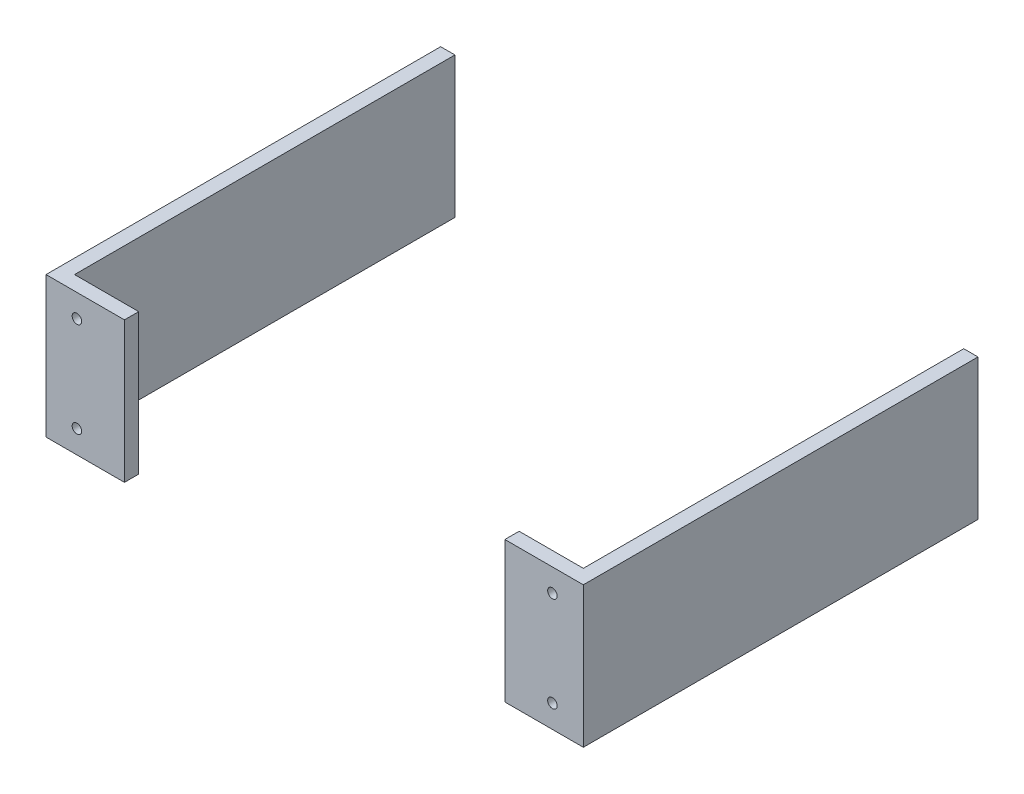
ISO-10303-21;
HEADER;
FILE_DESCRIPTION(('STEP AP214'),'2;1');
FILE_NAME('part.step','',(''),(''),'','','');
FILE_SCHEMA(('AUTOMOTIVE_DESIGN { 1 0 10303 214 1 1 1 1 }'));
ENDSEC;
DATA;
#1=APPLICATION_CONTEXT('core data for automotive mechanical design processes');
#2=APPLICATION_PROTOCOL_DEFINITION('international standard','automotive_design',2000,#1);
#3=PRODUCT_CONTEXT('',#1,'mechanical');
#4=PRODUCT('Part','Part','',(#3));
#5=PRODUCT_RELATED_PRODUCT_CATEGORY('part','',(#4));
#6=PRODUCT_DEFINITION_FORMATION('','',#4);
#7=PRODUCT_DEFINITION_CONTEXT('part definition',#1,'design');
#8=PRODUCT_DEFINITION('design','',#6,#7);
#9=PRODUCT_DEFINITION_SHAPE('','',#8);
#10=(LENGTH_UNIT() NAMED_UNIT(*) SI_UNIT(.MILLI.,.METRE.));
#11=(NAMED_UNIT(*) PLANE_ANGLE_UNIT() SI_UNIT($,.RADIAN.));
#12=(NAMED_UNIT(*) SI_UNIT($,.STERADIAN.) SOLID_ANGLE_UNIT());
#13=UNCERTAINTY_MEASURE_WITH_UNIT(LENGTH_MEASURE(1.E-05),#10,'distance_accuracy_value','');
#14=(GEOMETRIC_REPRESENTATION_CONTEXT(3) GLOBAL_UNCERTAINTY_ASSIGNED_CONTEXT((#13)) GLOBAL_UNIT_ASSIGNED_CONTEXT((#10,
#11,#12)) REPRESENTATION_CONTEXT('',''));
#15=CARTESIAN_POINT('',(0.,0.,0.));
#16=DIRECTION('',(0.,0.,1.));
#17=DIRECTION('',(1.,0.,0.));
#18=AXIS2_PLACEMENT_3D('',#15,#16,#17);
#19=CARTESIAN_POINT('',(0.,0.,0.));
#20=DIRECTION('',(0.,0.,1.));
#21=DIRECTION('',(1.,0.,0.));
#22=AXIS2_PLACEMENT_3D('',#19,#20,#21);
#23=PLANE('',#22);
#24=CARTESIAN_POINT('',(-50.,9.99999999999999,0.));
#25=DIRECTION('',(0.,0.,1.));
#26=DIRECTION('',(1.,0.,0.));
#27=AXIS2_PLACEMENT_3D('',#24,#25,#26);
#28=CIRCLE('',#27,0.999999999999998);
#29=CARTESIAN_POINT('',(-49.,9.99999999999999,0.));
#30=VERTEX_POINT('',#29);
#31=EDGE_CURVE('E126',#30,#30,#28,.T.);
#32=ORIENTED_EDGE('',*,*,#31,.T.);
#33=EDGE_LOOP('',(#32));
#34=FACE_BOUND('',#33,.T.);
#35=CARTESIAN_POINT('',(-50.,-10.,0.));
#36=DIRECTION('',(0.,0.,1.));
#37=DIRECTION('',(1.,0.,0.));
#38=AXIS2_PLACEMENT_3D('',#35,#36,#37);
#39=CIRCLE('',#38,0.999999999999998);
#40=CARTESIAN_POINT('',(-49.,-10.,0.));
#41=VERTEX_POINT('',#40);
#42=EDGE_CURVE('E121',#41,#41,#39,.T.);
#43=ORIENTED_EDGE('',*,*,#42,.T.);
#44=EDGE_LOOP('',(#43));
#45=FACE_BOUND('',#44,.T.);
#46=DIRECTION('',(1.,0.,0.));
#47=VECTOR('',#46,1.);
#48=CARTESIAN_POINT('',(0.,-14.8,0.));
#49=LINE('',#48,#47);
#50=CARTESIAN_POINT('',(-53.5,-14.8,0.));
#51=VERTEX_POINT('',#50);
#52=CARTESIAN_POINT('',(-40.,-14.8,0.));
#53=VERTEX_POINT('',#52);
#54=EDGE_CURVE('E62',#51,#53,#49,.T.);
#55=ORIENTED_EDGE('',*,*,#54,.F.);
#56=DIRECTION('',(0.,-1.,0.));
#57=VECTOR('',#56,1.);
#58=CARTESIAN_POINT('',(-53.5,15.,0.));
#59=LINE('',#58,#57);
#60=CARTESIAN_POINT('',(-53.5,14.8,0.));
#61=VERTEX_POINT('',#60);
#62=EDGE_CURVE('E132',#61,#51,#59,.T.);
#63=ORIENTED_EDGE('',*,*,#62,.F.);
#64=DIRECTION('',(-1.,0.,0.));
#65=VECTOR('',#64,1.);
#66=CARTESIAN_POINT('',(0.,14.8,0.));
#67=LINE('',#66,#65);
#68=CARTESIAN_POINT('',(-40.,14.8,0.));
#69=VERTEX_POINT('',#68);
#70=EDGE_CURVE('E146',#69,#61,#67,.T.);
#71=ORIENTED_EDGE('',*,*,#70,.F.);
#72=DIRECTION('',(0.,-1.,0.));
#73=VECTOR('',#72,1.);
#74=CARTESIAN_POINT('',(-40.,0.,0.));
#75=LINE('',#74,#73);
#76=EDGE_CURVE('E120',#69,#53,#75,.T.);
#77=ORIENTED_EDGE('',*,*,#76,.T.);
#78=EDGE_LOOP('',(#55,#63,#71,#77));
#79=FACE_BOUND('',#78,.T.);
#80=ADVANCED_FACE('F49',(#34,#45,#79),#23,.F.);
#81=CARTESIAN_POINT('',(0.,0.,3.));
#82=DIRECTION('',(0.,0.,1.));
#83=DIRECTION('',(1.,0.,0.));
#84=AXIS2_PLACEMENT_3D('',#81,#82,#83);
#85=PLANE('',#84);
#86=CARTESIAN_POINT('',(-50.,9.99999999999999,3.));
#87=DIRECTION('',(0.,0.,1.));
#88=DIRECTION('',(1.,0.,0.));
#89=AXIS2_PLACEMENT_3D('',#86,#87,#88);
#90=CIRCLE('',#89,0.999999999999998);
#91=CARTESIAN_POINT('',(-49.,9.99999999999999,3.));
#92=VERTEX_POINT('',#91);
#93=EDGE_CURVE('E117',#92,#92,#90,.T.);
#94=ORIENTED_EDGE('',*,*,#93,.F.);
#95=EDGE_LOOP('',(#94));
#96=FACE_BOUND('',#95,.T.);
#97=CARTESIAN_POINT('',(-50.,-10.,3.));
#98=DIRECTION('',(0.,0.,1.));
#99=DIRECTION('',(1.,0.,0.));
#100=AXIS2_PLACEMENT_3D('',#97,#98,#99);
#101=CIRCLE('',#100,0.999999999999998);
#102=CARTESIAN_POINT('',(-49.,-10.,3.));
#103=VERTEX_POINT('',#102);
#104=EDGE_CURVE('E114',#103,#103,#101,.T.);
#105=ORIENTED_EDGE('',*,*,#104,.F.);
#106=EDGE_LOOP('',(#105));
#107=FACE_BOUND('',#106,.T.);
#108=DIRECTION('',(0.,-1.,0.));
#109=VECTOR('',#108,1.);
#110=CARTESIAN_POINT('',(-56.5,-15.,3.));
#111=LINE('',#110,#109);
#112=CARTESIAN_POINT('',(-56.5,14.8,3.));
#113=VERTEX_POINT('',#112);
#114=CARTESIAN_POINT('',(-56.5,-14.8,3.));
#115=VERTEX_POINT('',#114);
#116=EDGE_CURVE('E111',#113,#115,#111,.T.);
#117=ORIENTED_EDGE('',*,*,#116,.T.);
#118=DIRECTION('',(1.,0.,0.));
#119=VECTOR('',#118,1.);
#120=CARTESIAN_POINT('',(0.,-14.8,3.));
#121=LINE('',#120,#119);
#122=CARTESIAN_POINT('',(-40.,-14.8,3.));
#123=VERTEX_POINT('',#122);
#124=EDGE_CURVE('E99',#115,#123,#121,.T.);
#125=ORIENTED_EDGE('',*,*,#124,.T.);
#126=DIRECTION('',(0.,-1.,0.));
#127=VECTOR('',#126,1.);
#128=CARTESIAN_POINT('',(-40.,-15.,3.));
#129=LINE('',#128,#127);
#130=CARTESIAN_POINT('',(-40.,14.8,3.));
#131=VERTEX_POINT('',#130);
#132=EDGE_CURVE('E109',#131,#123,#129,.T.);
#133=ORIENTED_EDGE('',*,*,#132,.F.);
#134=DIRECTION('',(-1.,0.,0.));
#135=VECTOR('',#134,1.);
#136=CARTESIAN_POINT('',(0.,14.8,3.));
#137=LINE('',#136,#135);
#138=EDGE_CURVE('E70',#131,#113,#137,.T.);
#139=ORIENTED_EDGE('',*,*,#138,.T.);
#140=EDGE_LOOP('',(#117,#125,#133,#139));
#141=FACE_BOUND('',#140,.T.);
#142=ADVANCED_FACE('F108',(#96,#107,#141),#85,.T.);
#143=CARTESIAN_POINT('',(-56.5,-15.,3.));
#144=DIRECTION('',(1.,0.,0.));
#145=DIRECTION('',(0.,0.,-1.));
#146=AXIS2_PLACEMENT_3D('',#143,#144,#145);
#147=PLANE('',#146);
#148=DIRECTION('',(0.,0.,-1.));
#149=VECTOR('',#148,1.);
#150=CARTESIAN_POINT('',(-56.5,-14.8,3.));
#151=LINE('',#150,#149);
#152=CARTESIAN_POINT('',(-56.5,-14.8,-80.));
#153=VERTEX_POINT('',#152);
#154=EDGE_CURVE('E151',#115,#153,#151,.T.);
#155=ORIENTED_EDGE('',*,*,#154,.F.);
#156=ORIENTED_EDGE('',*,*,#116,.F.);
#157=DIRECTION('',(0.,0.,1.));
#158=VECTOR('',#157,1.);
#159=CARTESIAN_POINT('',(-56.5,14.8,3.));
#160=LINE('',#159,#158);
#161=CARTESIAN_POINT('',(-56.5,14.8,-80.));
#162=VERTEX_POINT('',#161);
#163=EDGE_CURVE('E142',#162,#113,#160,.T.);
#164=ORIENTED_EDGE('',*,*,#163,.F.);
#165=DIRECTION('',(0.,1.,0.));
#166=VECTOR('',#165,1.);
#167=CARTESIAN_POINT('',(-56.5,15.,-80.));
#168=LINE('',#167,#166);
#169=EDGE_CURVE('E135',#153,#162,#168,.T.);
#170=ORIENTED_EDGE('',*,*,#169,.F.);
#171=EDGE_LOOP('',(#155,#156,#164,#170));
#172=FACE_BOUND('',#171,.T.);
#173=ADVANCED_FACE('F171',(#172),#147,.F.);
#174=CARTESIAN_POINT('',(-53.5,15.,-80.));
#175=DIRECTION('',(-1.,0.,0.));
#176=DIRECTION('',(0.,-1.,0.));
#177=AXIS2_PLACEMENT_3D('',#174,#175,#176);
#178=PLANE('',#177);
#179=DIRECTION('',(0.,0.,1.));
#180=VECTOR('',#179,1.);
#181=CARTESIAN_POINT('',(-53.5,-14.8,-80.));
#182=LINE('',#181,#180);
#183=CARTESIAN_POINT('',(-53.5,-14.8,-80.));
#184=VERTEX_POINT('',#183);
#185=EDGE_CURVE('E153',#184,#51,#182,.T.);
#186=ORIENTED_EDGE('',*,*,#185,.F.);
#187=DIRECTION('',(0.,-1.,0.));
#188=VECTOR('',#187,1.);
#189=CARTESIAN_POINT('',(-53.5,15.,-80.));
#190=LINE('',#189,#188);
#191=CARTESIAN_POINT('',(-53.5,14.8,-80.));
#192=VERTEX_POINT('',#191);
#193=EDGE_CURVE('E125',#192,#184,#190,.T.);
#194=ORIENTED_EDGE('',*,*,#193,.F.);
#195=DIRECTION('',(0.,0.,-1.));
#196=VECTOR('',#195,1.);
#197=CARTESIAN_POINT('',(-53.5,14.8,-80.));
#198=LINE('',#197,#196);
#199=EDGE_CURVE('E144',#61,#192,#198,.T.);
#200=ORIENTED_EDGE('',*,*,#199,.F.);
#201=ORIENTED_EDGE('',*,*,#62,.T.);
#202=EDGE_LOOP('',(#186,#194,#200,#201));
#203=FACE_BOUND('',#202,.T.);
#204=ADVANCED_FACE('F163',(#203),#178,.F.);
#205=CARTESIAN_POINT('',(0.,0.,-80.));
#206=DIRECTION('',(0.,0.,1.));
#207=DIRECTION('',(1.,0.,0.));
#208=AXIS2_PLACEMENT_3D('',#205,#206,#207);
#209=PLANE('',#208);
#210=DIRECTION('',(1.,0.,0.));
#211=VECTOR('',#210,1.);
#212=CARTESIAN_POINT('',(0.,-14.8,-80.));
#213=LINE('',#212,#211);
#214=EDGE_CURVE('E149',#153,#184,#213,.T.);
#215=ORIENTED_EDGE('',*,*,#214,.F.);
#216=ORIENTED_EDGE('',*,*,#169,.T.);
#217=DIRECTION('',(-1.,0.,0.));
#218=VECTOR('',#217,1.);
#219=CARTESIAN_POINT('',(0.,14.8,-80.));
#220=LINE('',#219,#218);
#221=EDGE_CURVE('E129',#192,#162,#220,.T.);
#222=ORIENTED_EDGE('',*,*,#221,.F.);
#223=ORIENTED_EDGE('',*,*,#193,.T.);
#224=EDGE_LOOP('',(#215,#216,#222,#223));
#225=FACE_BOUND('',#224,.T.);
#226=ADVANCED_FACE('F168',(#225),#209,.F.);
#227=CARTESIAN_POINT('',(-40.,-15.,-80.));
#228=DIRECTION('',(-1.,0.,0.));
#229=DIRECTION('',(0.,0.,1.));
#230=AXIS2_PLACEMENT_3D('',#227,#228,#229);
#231=PLANE('',#230);
#232=DIRECTION('',(0.,0.,1.));
#233=VECTOR('',#232,1.);
#234=CARTESIAN_POINT('',(-40.,-14.8,-80.));
#235=LINE('',#234,#233);
#236=EDGE_CURVE('E12',#53,#123,#235,.T.);
#237=ORIENTED_EDGE('',*,*,#236,.F.);
#238=ORIENTED_EDGE('',*,*,#76,.F.);
#239=DIRECTION('',(0.,0.,-1.));
#240=VECTOR('',#239,1.);
#241=CARTESIAN_POINT('',(-40.,14.8,-80.));
#242=LINE('',#241,#240);
#243=EDGE_CURVE('E56',#131,#69,#242,.T.);
#244=ORIENTED_EDGE('',*,*,#243,.F.);
#245=ORIENTED_EDGE('',*,*,#132,.T.);
#246=EDGE_LOOP('',(#237,#238,#244,#245));
#247=FACE_BOUND('',#246,.T.);
#248=ADVANCED_FACE('F113',(#247),#231,.F.);
#249=CARTESIAN_POINT('',(-50.,9.99999999999999,-7.5));
#250=DIRECTION('',(0.,0.,1.));
#251=DIRECTION('',(1.,0.,0.));
#252=AXIS2_PLACEMENT_3D('',#249,#250,#251);
#253=CYLINDRICAL_SURFACE('',#252,0.999999999999998);
#254=CARTESIAN_POINT('',(-49.,9.99999999999999,3.));
#255=CARTESIAN_POINT('',(-49.,9.99999999999999,2.96875));
#256=CARTESIAN_POINT('',(-49.,9.99999999999999,2.9375));
#257=CARTESIAN_POINT('',(-49.,9.99999999999999,2.875));
#258=CARTESIAN_POINT('',(-49.,9.99999999999999,2.84375));
#259=CARTESIAN_POINT('',(-49.,9.99999999999999,2.78125));
#260=CARTESIAN_POINT('',(-49.,9.99999999999999,2.75));
#261=CARTESIAN_POINT('',(-49.,9.99999999999999,2.6875));
#262=CARTESIAN_POINT('',(-49.,9.99999999999999,2.65625));
#263=CARTESIAN_POINT('',(-49.,9.99999999999999,2.59375));
#264=CARTESIAN_POINT('',(-49.,9.99999999999999,2.5625));
#265=CARTESIAN_POINT('',(-49.,9.99999999999999,2.5));
#266=CARTESIAN_POINT('',(-49.,9.99999999999999,2.46875));
#267=CARTESIAN_POINT('',(-49.,9.99999999999999,2.40625));
#268=CARTESIAN_POINT('',(-49.,9.99999999999999,2.375));
#269=CARTESIAN_POINT('',(-49.,9.99999999999999,2.3125));
#270=CARTESIAN_POINT('',(-49.,9.99999999999999,2.28125));
#271=CARTESIAN_POINT('',(-49.,9.99999999999999,2.21875));
#272=CARTESIAN_POINT('',(-49.,9.99999999999999,2.1875));
#273=CARTESIAN_POINT('',(-49.,9.99999999999999,2.125));
#274=CARTESIAN_POINT('',(-49.,9.99999999999999,2.09375));
#275=CARTESIAN_POINT('',(-49.,9.99999999999999,2.03125));
#276=CARTESIAN_POINT('',(-49.,9.99999999999999,2.));
#277=CARTESIAN_POINT('',(-49.,9.99999999999999,1.9375));
#278=CARTESIAN_POINT('',(-49.,9.99999999999999,1.90625));
#279=CARTESIAN_POINT('',(-49.,9.99999999999999,1.84375));
#280=CARTESIAN_POINT('',(-49.,9.99999999999999,1.8125));
#281=CARTESIAN_POINT('',(-49.,9.99999999999999,1.75));
#282=CARTESIAN_POINT('',(-49.,9.99999999999999,1.71875));
#283=CARTESIAN_POINT('',(-49.,9.99999999999999,1.65625));
#284=CARTESIAN_POINT('',(-49.,9.99999999999999,1.625));
#285=CARTESIAN_POINT('',(-49.,9.99999999999999,1.5625));
#286=CARTESIAN_POINT('',(-49.,9.99999999999999,1.53125));
#287=CARTESIAN_POINT('',(-49.,9.99999999999999,1.46875));
#288=CARTESIAN_POINT('',(-49.,9.99999999999999,1.4375));
#289=CARTESIAN_POINT('',(-49.,9.99999999999999,1.375));
#290=CARTESIAN_POINT('',(-49.,9.99999999999999,1.34375));
#291=CARTESIAN_POINT('',(-49.,9.99999999999999,1.28125));
#292=CARTESIAN_POINT('',(-49.,9.99999999999999,1.25));
#293=CARTESIAN_POINT('',(-49.,9.99999999999999,1.1875));
#294=CARTESIAN_POINT('',(-49.,9.99999999999999,1.15625));
#295=CARTESIAN_POINT('',(-49.,9.99999999999999,1.09375));
#296=CARTESIAN_POINT('',(-49.,9.99999999999999,1.0625));
#297=CARTESIAN_POINT('',(-49.,9.99999999999999,1.));
#298=CARTESIAN_POINT('',(-49.,9.99999999999999,0.96875));
#299=CARTESIAN_POINT('',(-49.,9.99999999999999,0.90625));
#300=CARTESIAN_POINT('',(-49.,9.99999999999999,0.875));
#301=CARTESIAN_POINT('',(-49.,9.99999999999999,0.8125));
#302=CARTESIAN_POINT('',(-49.,9.99999999999999,0.78125));
#303=CARTESIAN_POINT('',(-49.,9.99999999999999,0.71875));
#304=CARTESIAN_POINT('',(-49.,9.99999999999999,0.6875));
#305=CARTESIAN_POINT('',(-49.,9.99999999999999,0.625));
#306=CARTESIAN_POINT('',(-49.,9.99999999999999,0.59375));
#307=CARTESIAN_POINT('',(-49.,9.99999999999999,0.53125));
#308=CARTESIAN_POINT('',(-49.,9.99999999999999,0.5));
#309=CARTESIAN_POINT('',(-49.,9.99999999999999,0.4375));
#310=CARTESIAN_POINT('',(-49.,9.99999999999999,0.40625));
#311=CARTESIAN_POINT('',(-49.,9.99999999999999,0.34375));
#312=CARTESIAN_POINT('',(-49.,9.99999999999999,0.3125));
#313=CARTESIAN_POINT('',(-49.,9.99999999999999,0.25));
#314=CARTESIAN_POINT('',(-49.,9.99999999999999,0.21875));
#315=CARTESIAN_POINT('',(-49.,9.99999999999999,0.15625));
#316=CARTESIAN_POINT('',(-49.,9.99999999999999,0.125));
#317=CARTESIAN_POINT('',(-49.,9.99999999999999,0.0625000000000001));
#318=CARTESIAN_POINT('',(-49.,9.99999999999999,0.03125));
#319=CARTESIAN_POINT('',(-49.,9.99999999999999,0.));
#320=B_SPLINE_CURVE_WITH_KNOTS('',3,(#254,#255,#256,#257,#258,#259,#260,#261,#262,#263,#264,
#265,#266,#267,#268,#269,#270,#271,#272,#273,#274,#275,#276,#277,#278,#279,#280,#281,#282,#283,
#284,#285,#286,#287,#288,#289,#290,#291,#292,#293,#294,#295,#296,#297,#298,#299,#300,#301,#302,
#303,#304,#305,#306,#307,#308,#309,#310,#311,#312,#313,#314,#315,#316,#317,#318,#319),
.UNSPECIFIED.,.F.,.F.,(4,2,2,2,2,2,2,2,2,2,2,2,2,2,2,2,2,2,2,2,2,2,2,2,2,2,2,2,2,2,2,2,4),(0.,
0.0937500000000001,0.1875,0.28125,0.375,0.46875,0.5625,0.656250000000001,0.750000000000001,
0.843750000000001,0.937500000000001,1.03125,1.125,1.21875,1.3125,1.40625,1.5,1.59375,1.6875,
1.78125,1.875,1.96875,2.0625,2.15625,2.25,2.34375,2.4375,2.53125,2.625,2.71875,2.8125,2.90625,
3.),.UNSPECIFIED.);
#321=EDGE_CURVE('BSEAM193',#92,#30,#320,.T.);
#322=ORIENTED_EDGE('',*,*,#93,.T.);
#323=ORIENTED_EDGE('',*,*,#31,.F.);
#324=ORIENTED_EDGE('',*,*,#321,.T.);
#325=ORIENTED_EDGE('',*,*,#321,.F.);
#326=EDGE_LOOP('',(#322,#324,#323,#325));
#327=FACE_BOUND('',#326,.T.);
#328=ADVANCED_FACE('F193',(#327),#253,.F.);
#329=CARTESIAN_POINT('',(-50.,-10.,-7.5));
#330=DIRECTION('',(0.,0.,1.));
#331=DIRECTION('',(1.,0.,0.));
#332=AXIS2_PLACEMENT_3D('',#329,#330,#331);
#333=CYLINDRICAL_SURFACE('',#332,0.999999999999998);
#334=CARTESIAN_POINT('',(-49.,-10.,3.));
#335=CARTESIAN_POINT('',(-49.,-10.,2.96875));
#336=CARTESIAN_POINT('',(-49.,-10.,2.9375));
#337=CARTESIAN_POINT('',(-49.,-10.,2.875));
#338=CARTESIAN_POINT('',(-49.,-10.,2.84375));
#339=CARTESIAN_POINT('',(-49.,-10.,2.78125));
#340=CARTESIAN_POINT('',(-49.,-10.,2.75));
#341=CARTESIAN_POINT('',(-49.,-10.,2.6875));
#342=CARTESIAN_POINT('',(-49.,-10.,2.65625));
#343=CARTESIAN_POINT('',(-49.,-10.,2.59375));
#344=CARTESIAN_POINT('',(-49.,-10.,2.5625));
#345=CARTESIAN_POINT('',(-49.,-10.,2.5));
#346=CARTESIAN_POINT('',(-49.,-10.,2.46875));
#347=CARTESIAN_POINT('',(-49.,-10.,2.40625));
#348=CARTESIAN_POINT('',(-49.,-10.,2.375));
#349=CARTESIAN_POINT('',(-49.,-10.,2.3125));
#350=CARTESIAN_POINT('',(-49.,-10.,2.28125));
#351=CARTESIAN_POINT('',(-49.,-10.,2.21875));
#352=CARTESIAN_POINT('',(-49.,-10.,2.1875));
#353=CARTESIAN_POINT('',(-49.,-10.,2.125));
#354=CARTESIAN_POINT('',(-49.,-10.,2.09375));
#355=CARTESIAN_POINT('',(-49.,-10.,2.03125));
#356=CARTESIAN_POINT('',(-49.,-10.,2.));
#357=CARTESIAN_POINT('',(-49.,-10.,1.9375));
#358=CARTESIAN_POINT('',(-49.,-10.,1.90625));
#359=CARTESIAN_POINT('',(-49.,-10.,1.84375));
#360=CARTESIAN_POINT('',(-49.,-10.,1.8125));
#361=CARTESIAN_POINT('',(-49.,-10.,1.75));
#362=CARTESIAN_POINT('',(-49.,-10.,1.71875));
#363=CARTESIAN_POINT('',(-49.,-10.,1.65625));
#364=CARTESIAN_POINT('',(-49.,-10.,1.625));
#365=CARTESIAN_POINT('',(-49.,-10.,1.5625));
#366=CARTESIAN_POINT('',(-49.,-10.,1.53125));
#367=CARTESIAN_POINT('',(-49.,-10.,1.46875));
#368=CARTESIAN_POINT('',(-49.,-10.,1.4375));
#369=CARTESIAN_POINT('',(-49.,-10.,1.375));
#370=CARTESIAN_POINT('',(-49.,-10.,1.34375));
#371=CARTESIAN_POINT('',(-49.,-10.,1.28125));
#372=CARTESIAN_POINT('',(-49.,-10.,1.25));
#373=CARTESIAN_POINT('',(-49.,-10.,1.1875));
#374=CARTESIAN_POINT('',(-49.,-10.,1.15625));
#375=CARTESIAN_POINT('',(-49.,-10.,1.09375));
#376=CARTESIAN_POINT('',(-49.,-10.,1.0625));
#377=CARTESIAN_POINT('',(-49.,-10.,1.));
#378=CARTESIAN_POINT('',(-49.,-10.,0.96875));
#379=CARTESIAN_POINT('',(-49.,-10.,0.90625));
#380=CARTESIAN_POINT('',(-49.,-10.,0.875));
#381=CARTESIAN_POINT('',(-49.,-10.,0.8125));
#382=CARTESIAN_POINT('',(-49.,-10.,0.78125));
#383=CARTESIAN_POINT('',(-49.,-10.,0.71875));
#384=CARTESIAN_POINT('',(-49.,-10.,0.6875));
#385=CARTESIAN_POINT('',(-49.,-10.,0.625));
#386=CARTESIAN_POINT('',(-49.,-10.,0.59375));
#387=CARTESIAN_POINT('',(-49.,-10.,0.53125));
#388=CARTESIAN_POINT('',(-49.,-10.,0.5));
#389=CARTESIAN_POINT('',(-49.,-10.,0.4375));
#390=CARTESIAN_POINT('',(-49.,-10.,0.40625));
#391=CARTESIAN_POINT('',(-49.,-10.,0.34375));
#392=CARTESIAN_POINT('',(-49.,-10.,0.3125));
#393=CARTESIAN_POINT('',(-49.,-10.,0.25));
#394=CARTESIAN_POINT('',(-49.,-10.,0.21875));
#395=CARTESIAN_POINT('',(-49.,-10.,0.15625));
#396=CARTESIAN_POINT('',(-49.,-10.,0.125));
#397=CARTESIAN_POINT('',(-49.,-10.,0.0625000000000001));
#398=CARTESIAN_POINT('',(-49.,-10.,0.03125));
#399=CARTESIAN_POINT('',(-49.,-10.,0.));
#400=B_SPLINE_CURVE_WITH_KNOTS('',3,(#334,#335,#336,#337,#338,#339,#340,#341,#342,#343,#344,
#345,#346,#347,#348,#349,#350,#351,#352,#353,#354,#355,#356,#357,#358,#359,#360,#361,#362,#363,
#364,#365,#366,#367,#368,#369,#370,#371,#372,#373,#374,#375,#376,#377,#378,#379,#380,#381,#382,
#383,#384,#385,#386,#387,#388,#389,#390,#391,#392,#393,#394,#395,#396,#397,#398,#399),
.UNSPECIFIED.,.F.,.F.,(4,2,2,2,2,2,2,2,2,2,2,2,2,2,2,2,2,2,2,2,2,2,2,2,2,2,2,2,2,2,2,2,4),(0.,
0.0937500000000001,0.1875,0.28125,0.375,0.46875,0.5625,0.656250000000001,0.750000000000001,
0.843750000000001,0.937500000000001,1.03125,1.125,1.21875,1.3125,1.40625,1.5,1.59375,1.6875,
1.78125,1.875,1.96875,2.0625,2.15625,2.25,2.34375,2.4375,2.53125,2.625,2.71875,2.8125,2.90625,
3.),.UNSPECIFIED.);
#401=EDGE_CURVE('BSEAM191',#103,#41,#400,.T.);
#402=ORIENTED_EDGE('',*,*,#104,.T.);
#403=ORIENTED_EDGE('',*,*,#42,.F.);
#404=ORIENTED_EDGE('',*,*,#401,.T.);
#405=ORIENTED_EDGE('',*,*,#401,.F.);
#406=EDGE_LOOP('',(#402,#404,#403,#405));
#407=FACE_BOUND('',#406,.T.);
#408=ADVANCED_FACE('F191',(#407),#333,.F.);
#409=CARTESIAN_POINT('',(0.,14.8,0.));
#410=DIRECTION('',(0.,1.,0.));
#411=DIRECTION('',(-1.,0.,0.));
#412=AXIS2_PLACEMENT_3D('',#409,#410,#411);
#413=PLANE('',#412);
#414=ORIENTED_EDGE('',*,*,#221,.T.);
#415=ORIENTED_EDGE('',*,*,#163,.T.);
#416=ORIENTED_EDGE('',*,*,#138,.F.);
#417=ORIENTED_EDGE('',*,*,#243,.T.);
#418=ORIENTED_EDGE('',*,*,#70,.T.);
#419=ORIENTED_EDGE('',*,*,#199,.T.);
#420=EDGE_LOOP('',(#414,#415,#416,#417,#418,#419));
#421=FACE_BOUND('',#420,.T.);
#422=ADVANCED_FACE('F165',(#421),#413,.T.);
#423=CARTESIAN_POINT('',(0.,-14.8,0.));
#424=DIRECTION('',(0.,-1.,0.));
#425=DIRECTION('',(1.,0.,0.));
#426=AXIS2_PLACEMENT_3D('',#423,#424,#425);
#427=PLANE('',#426);
#428=ORIENTED_EDGE('',*,*,#214,.T.);
#429=ORIENTED_EDGE('',*,*,#185,.T.);
#430=ORIENTED_EDGE('',*,*,#54,.T.);
#431=ORIENTED_EDGE('',*,*,#236,.T.);
#432=ORIENTED_EDGE('',*,*,#124,.F.);
#433=ORIENTED_EDGE('',*,*,#154,.T.);
#434=EDGE_LOOP('',(#428,#429,#430,#431,#432,#433));
#435=FACE_BOUND('',#434,.T.);
#436=ADVANCED_FACE('F98',(#435),#427,.T.);
#437=CLOSED_SHELL('',(#80,#142,#173,#204,#226,#248,#328,#408,#422,#436));
#438=MANIFOLD_SOLID_BREP('B2',#437);
#439=CARTESIAN_POINT('',(53.5,15.,-80.));
#440=DIRECTION('',(1.,0.,0.));
#441=DIRECTION('',(0.,0.,-1.));
#442=AXIS2_PLACEMENT_3D('',#439,#440,#441);
#443=PLANE('',#442);
#444=DIRECTION('',(0.,0.,-1.));
#445=VECTOR('',#444,1.);
#446=CARTESIAN_POINT('',(53.5,-14.8,-80.));
#447=LINE('',#446,#445);
#448=CARTESIAN_POINT('',(53.5,-14.8,0.));
#449=VERTEX_POINT('',#448);
#450=CARTESIAN_POINT('',(53.5,-14.8,-80.));
#451=VERTEX_POINT('',#450);
#452=EDGE_CURVE('E373',#449,#451,#447,.T.);
#453=ORIENTED_EDGE('',*,*,#452,.F.);
#454=DIRECTION('',(0.,1.,0.));
#455=VECTOR('',#454,1.);
#456=CARTESIAN_POINT('',(53.5,15.,0.));
#457=LINE('',#456,#455);
#458=CARTESIAN_POINT('',(53.5,14.8,0.));
#459=VERTEX_POINT('',#458);
#460=EDGE_CURVE('E328',#449,#459,#457,.T.);
#461=ORIENTED_EDGE('',*,*,#460,.T.);
#462=DIRECTION('',(0.,0.,1.));
#463=VECTOR('',#462,1.);
#464=CARTESIAN_POINT('',(53.5,14.8,-80.));
#465=LINE('',#464,#463);
#466=CARTESIAN_POINT('',(53.5,14.8,-80.));
#467=VERTEX_POINT('',#466);
#468=EDGE_CURVE('E339',#467,#459,#465,.T.);
#469=ORIENTED_EDGE('',*,*,#468,.F.);
#470=DIRECTION('',(0.,1.,0.));
#471=VECTOR('',#470,1.);
#472=CARTESIAN_POINT('',(53.5,15.,-80.));
#473=LINE('',#472,#471);
#474=EDGE_CURVE('E354',#451,#467,#473,.T.);
#475=ORIENTED_EDGE('',*,*,#474,.F.);
#476=EDGE_LOOP('',(#453,#461,#469,#475));
#477=FACE_BOUND('',#476,.T.);
#478=ADVANCED_FACE('F270',(#477),#443,.F.);
#479=CARTESIAN_POINT('',(0.,0.,-80.));
#480=DIRECTION('',(0.,0.,-1.));
#481=DIRECTION('',(-1.,0.,0.));
#482=AXIS2_PLACEMENT_3D('',#479,#480,#481);
#483=PLANE('',#482);
#484=DIRECTION('',(0.,-1.,0.));
#485=VECTOR('',#484,1.);
#486=CARTESIAN_POINT('',(56.5,15.,-80.));
#487=LINE('',#486,#485);
#488=CARTESIAN_POINT('',(56.5,14.8,-80.));
#489=VERTEX_POINT('',#488);
#490=CARTESIAN_POINT('',(56.5,-14.8,-80.));
#491=VERTEX_POINT('',#490);
#492=EDGE_CURVE('E351',#489,#491,#487,.T.);
#493=ORIENTED_EDGE('',*,*,#492,.T.);
#494=DIRECTION('',(-1.,0.,0.));
#495=VECTOR('',#494,1.);
#496=CARTESIAN_POINT('',(0.,-14.8,-80.));
#497=LINE('',#496,#495);
#498=EDGE_CURVE('E383',#491,#451,#497,.T.);
#499=ORIENTED_EDGE('',*,*,#498,.T.);
#500=ORIENTED_EDGE('',*,*,#474,.T.);
#501=DIRECTION('',(1.,0.,0.));
#502=VECTOR('',#501,1.);
#503=CARTESIAN_POINT('',(0.,14.8,-80.));
#504=LINE('',#503,#502);
#505=EDGE_CURVE('E371',#467,#489,#504,.T.);
#506=ORIENTED_EDGE('',*,*,#505,.T.);
#507=EDGE_LOOP('',(#493,#499,#500,#506));
#508=FACE_BOUND('',#507,.T.);
#509=ADVANCED_FACE('F392',(#508),#483,.T.);
#510=CARTESIAN_POINT('',(56.5,-15.,3.));
#511=DIRECTION('',(-1.,0.,0.));
#512=DIRECTION('',(0.,0.,1.));
#513=AXIS2_PLACEMENT_3D('',#510,#511,#512);
#514=PLANE('',#513);
#515=DIRECTION('',(0.,0.,1.));
#516=VECTOR('',#515,1.);
#517=CARTESIAN_POINT('',(56.5,-14.8,3.));
#518=LINE('',#517,#516);
#519=CARTESIAN_POINT('',(56.5,-14.8,3.));
#520=VERTEX_POINT('',#519);
#521=EDGE_CURVE('E384',#491,#520,#518,.T.);
#522=ORIENTED_EDGE('',*,*,#521,.F.);
#523=ORIENTED_EDGE('',*,*,#492,.F.);
#524=DIRECTION('',(0.,0.,-1.));
#525=VECTOR('',#524,1.);
#526=CARTESIAN_POINT('',(56.5,14.8,3.));
#527=LINE('',#526,#525);
#528=CARTESIAN_POINT('',(56.5,14.8,3.));
#529=VERTEX_POINT('',#528);
#530=EDGE_CURVE('E369',#529,#489,#527,.T.);
#531=ORIENTED_EDGE('',*,*,#530,.F.);
#532=DIRECTION('',(0.,1.,0.));
#533=VECTOR('',#532,1.);
#534=CARTESIAN_POINT('',(56.5,-15.,3.));
#535=LINE('',#534,#533);
#536=EDGE_CURVE('E356',#520,#529,#535,.T.);
#537=ORIENTED_EDGE('',*,*,#536,.F.);
#538=EDGE_LOOP('',(#522,#523,#531,#537));
#539=FACE_BOUND('',#538,.T.);
#540=ADVANCED_FACE('F272',(#539),#514,.F.);
#541=CARTESIAN_POINT('',(0.,0.,3.));
#542=DIRECTION('',(0.,0.,1.));
#543=DIRECTION('',(1.,0.,0.));
#544=AXIS2_PLACEMENT_3D('',#541,#542,#543);
#545=PLANE('',#544);
#546=CARTESIAN_POINT('',(50.,-9.99999999999999,3.));
#547=DIRECTION('',(0.,0.,1.));
#548=DIRECTION('',(1.,0.,0.));
#549=AXIS2_PLACEMENT_3D('',#546,#547,#548);
#550=CIRCLE('',#549,0.999999999999998);
#551=CARTESIAN_POINT('',(51.,-9.99999999999999,3.));
#552=VERTEX_POINT('',#551);
#553=EDGE_CURVE('E333',#552,#552,#550,.T.);
#554=ORIENTED_EDGE('',*,*,#553,.F.);
#555=EDGE_LOOP('',(#554));
#556=FACE_BOUND('',#555,.T.);
#557=CARTESIAN_POINT('',(50.,10.,3.));
#558=DIRECTION('',(0.,0.,1.));
#559=DIRECTION('',(1.,0.,0.));
#560=AXIS2_PLACEMENT_3D('',#557,#558,#559);
#561=CIRCLE('',#560,0.999999999999998);
#562=CARTESIAN_POINT('',(51.,10.,3.));
#563=VERTEX_POINT('',#562);
#564=EDGE_CURVE('E337',#563,#563,#561,.T.);
#565=ORIENTED_EDGE('',*,*,#564,.F.);
#566=EDGE_LOOP('',(#565));
#567=FACE_BOUND('',#566,.T.);
#568=DIRECTION('',(0.,1.,0.));
#569=VECTOR('',#568,1.);
#570=CARTESIAN_POINT('',(40.,-15.,3.));
#571=LINE('',#570,#569);
#572=CARTESIAN_POINT('',(40.,-14.8,3.));
#573=VERTEX_POINT('',#572);
#574=CARTESIAN_POINT('',(40.,14.8,3.));
#575=VERTEX_POINT('',#574);
#576=EDGE_CURVE('E334',#573,#575,#571,.T.);
#577=ORIENTED_EDGE('',*,*,#576,.F.);
#578=DIRECTION('',(1.,0.,0.));
#579=VECTOR('',#578,1.);
#580=CARTESIAN_POINT('',(0.,-14.8,3.));
#581=LINE('',#580,#579);
#582=EDGE_CURVE('E284',#573,#520,#581,.T.);
#583=ORIENTED_EDGE('',*,*,#582,.T.);
#584=ORIENTED_EDGE('',*,*,#536,.T.);
#585=DIRECTION('',(-1.,0.,0.));
#586=VECTOR('',#585,1.);
#587=CARTESIAN_POINT('',(0.,14.8,3.));
#588=LINE('',#587,#586);
#589=EDGE_CURVE('E363',#529,#575,#588,.T.);
#590=ORIENTED_EDGE('',*,*,#589,.T.);
#591=EDGE_LOOP('',(#577,#583,#584,#590));
#592=FACE_BOUND('',#591,.T.);
#593=ADVANCED_FACE('F367',(#556,#567,#592),#545,.T.);
#594=CARTESIAN_POINT('',(0.,0.,0.));
#595=DIRECTION('',(0.,0.,1.));
#596=DIRECTION('',(1.,0.,0.));
#597=AXIS2_PLACEMENT_3D('',#594,#595,#596);
#598=PLANE('',#597);
#599=CARTESIAN_POINT('',(50.,-9.99999999999999,0.));
#600=DIRECTION('',(0.,0.,1.));
#601=DIRECTION('',(1.,0.,0.));
#602=AXIS2_PLACEMENT_3D('',#599,#600,#601);
#603=CIRCLE('',#602,0.999999999999998);
#604=CARTESIAN_POINT('',(51.,-9.99999999999999,0.));
#605=VERTEX_POINT('',#604);
#606=EDGE_CURVE('E348',#605,#605,#603,.T.);
#607=ORIENTED_EDGE('',*,*,#606,.T.);
#608=EDGE_LOOP('',(#607));
#609=FACE_BOUND('',#608,.T.);
#610=CARTESIAN_POINT('',(50.,10.,0.));
#611=DIRECTION('',(0.,0.,1.));
#612=DIRECTION('',(1.,0.,0.));
#613=AXIS2_PLACEMENT_3D('',#610,#611,#612);
#614=CIRCLE('',#613,0.999999999999998);
#615=CARTESIAN_POINT('',(51.,10.,0.));
#616=VERTEX_POINT('',#615);
#617=EDGE_CURVE('E344',#616,#616,#614,.T.);
#618=ORIENTED_EDGE('',*,*,#617,.T.);
#619=EDGE_LOOP('',(#618));
#620=FACE_BOUND('',#619,.T.);
#621=DIRECTION('',(1.,0.,0.));
#622=VECTOR('',#621,1.);
#623=CARTESIAN_POINT('',(0.,-14.8,0.));
#624=LINE('',#623,#622);
#625=CARTESIAN_POINT('',(40.,-14.8,0.));
#626=VERTEX_POINT('',#625);
#627=EDGE_CURVE('E322',#626,#449,#624,.T.);
#628=ORIENTED_EDGE('',*,*,#627,.F.);
#629=DIRECTION('',(0.,1.,0.));
#630=VECTOR('',#629,1.);
#631=CARTESIAN_POINT('',(40.,0.,0.));
#632=LINE('',#631,#630);
#633=CARTESIAN_POINT('',(40.,14.8,0.));
#634=VERTEX_POINT('',#633);
#635=EDGE_CURVE('E292',#626,#634,#632,.T.);
#636=ORIENTED_EDGE('',*,*,#635,.T.);
#637=DIRECTION('',(-1.,0.,0.));
#638=VECTOR('',#637,1.);
#639=CARTESIAN_POINT('',(0.,14.8,0.));
#640=LINE('',#639,#638);
#641=EDGE_CURVE('E365',#459,#634,#640,.T.);
#642=ORIENTED_EDGE('',*,*,#641,.F.);
#643=ORIENTED_EDGE('',*,*,#460,.F.);
#644=EDGE_LOOP('',(#628,#636,#642,#643));
#645=FACE_BOUND('',#644,.T.);
#646=ADVANCED_FACE('F327',(#609,#620,#645),#598,.F.);
#647=CARTESIAN_POINT('',(40.,-15.,-80.));
#648=DIRECTION('',(1.,0.,0.));
#649=DIRECTION('',(0.,0.,-1.));
#650=AXIS2_PLACEMENT_3D('',#647,#648,#649);
#651=PLANE('',#650);
#652=DIRECTION('',(0.,0.,-1.));
#653=VECTOR('',#652,1.);
#654=CARTESIAN_POINT('',(40.,-14.8,-80.));
#655=LINE('',#654,#653);
#656=EDGE_CURVE('E47',#573,#626,#655,.T.);
#657=ORIENTED_EDGE('',*,*,#656,.F.);
#658=ORIENTED_EDGE('',*,*,#576,.T.);
#659=DIRECTION('',(0.,0.,1.));
#660=VECTOR('',#659,1.);
#661=CARTESIAN_POINT('',(40.,14.8,-80.));
#662=LINE('',#661,#660);
#663=EDGE_CURVE('E278',#634,#575,#662,.T.);
#664=ORIENTED_EDGE('',*,*,#663,.F.);
#665=ORIENTED_EDGE('',*,*,#635,.F.);
#666=EDGE_LOOP('',(#657,#658,#664,#665));
#667=FACE_BOUND('',#666,.T.);
#668=ADVANCED_FACE('F331',(#667),#651,.F.);
#669=CARTESIAN_POINT('',(50.,10.,-7.5));
#670=DIRECTION('',(0.,0.,1.));
#671=DIRECTION('',(1.,0.,0.));
#672=AXIS2_PLACEMENT_3D('',#669,#670,#671);
#673=CYLINDRICAL_SURFACE('',#672,0.999999999999998);
#674=CARTESIAN_POINT('',(51.,10.,3.));
#675=CARTESIAN_POINT('',(51.,10.,2.96875));
#676=CARTESIAN_POINT('',(51.,10.,2.9375));
#677=CARTESIAN_POINT('',(51.,10.,2.875));
#678=CARTESIAN_POINT('',(51.,10.,2.84375));
#679=CARTESIAN_POINT('',(51.,10.,2.78125));
#680=CARTESIAN_POINT('',(51.,10.,2.75));
#681=CARTESIAN_POINT('',(51.,10.,2.6875));
#682=CARTESIAN_POINT('',(51.,10.,2.65625));
#683=CARTESIAN_POINT('',(51.,10.,2.59375));
#684=CARTESIAN_POINT('',(51.,10.,2.5625));
#685=CARTESIAN_POINT('',(51.,10.,2.5));
#686=CARTESIAN_POINT('',(51.,10.,2.46875));
#687=CARTESIAN_POINT('',(51.,10.,2.40625));
#688=CARTESIAN_POINT('',(51.,10.,2.375));
#689=CARTESIAN_POINT('',(51.,10.,2.3125));
#690=CARTESIAN_POINT('',(51.,10.,2.28125));
#691=CARTESIAN_POINT('',(51.,10.,2.21875));
#692=CARTESIAN_POINT('',(51.,10.,2.1875));
#693=CARTESIAN_POINT('',(51.,10.,2.125));
#694=CARTESIAN_POINT('',(51.,10.,2.09375));
#695=CARTESIAN_POINT('',(51.,10.,2.03125));
#696=CARTESIAN_POINT('',(51.,10.,2.));
#697=CARTESIAN_POINT('',(51.,10.,1.9375));
#698=CARTESIAN_POINT('',(51.,10.,1.90625));
#699=CARTESIAN_POINT('',(51.,10.,1.84375));
#700=CARTESIAN_POINT('',(51.,10.,1.8125));
#701=CARTESIAN_POINT('',(51.,10.,1.75));
#702=CARTESIAN_POINT('',(51.,10.,1.71875));
#703=CARTESIAN_POINT('',(51.,10.,1.65625));
#704=CARTESIAN_POINT('',(51.,10.,1.625));
#705=CARTESIAN_POINT('',(51.,10.,1.5625));
#706=CARTESIAN_POINT('',(51.,10.,1.53125));
#707=CARTESIAN_POINT('',(51.,10.,1.46875));
#708=CARTESIAN_POINT('',(51.,10.,1.4375));
#709=CARTESIAN_POINT('',(51.,10.,1.375));
#710=CARTESIAN_POINT('',(51.,10.,1.34375));
#711=CARTESIAN_POINT('',(51.,10.,1.28125));
#712=CARTESIAN_POINT('',(51.,10.,1.25));
#713=CARTESIAN_POINT('',(51.,10.,1.1875));
#714=CARTESIAN_POINT('',(51.,10.,1.15625));
#715=CARTESIAN_POINT('',(51.,10.,1.09375));
#716=CARTESIAN_POINT('',(51.,10.,1.0625));
#717=CARTESIAN_POINT('',(51.,10.,1.));
#718=CARTESIAN_POINT('',(51.,10.,0.96875));
#719=CARTESIAN_POINT('',(51.,10.,0.90625));
#720=CARTESIAN_POINT('',(51.,10.,0.875));
#721=CARTESIAN_POINT('',(51.,10.,0.8125));
#722=CARTESIAN_POINT('',(51.,10.,0.78125));
#723=CARTESIAN_POINT('',(51.,10.,0.71875));
#724=CARTESIAN_POINT('',(51.,10.,0.6875));
#725=CARTESIAN_POINT('',(51.,10.,0.625));
#726=CARTESIAN_POINT('',(51.,10.,0.59375));
#727=CARTESIAN_POINT('',(51.,10.,0.53125));
#728=CARTESIAN_POINT('',(51.,10.,0.5));
#729=CARTESIAN_POINT('',(51.,10.,0.4375));
#730=CARTESIAN_POINT('',(51.,10.,0.40625));
#731=CARTESIAN_POINT('',(51.,10.,0.34375));
#732=CARTESIAN_POINT('',(51.,10.,0.3125));
#733=CARTESIAN_POINT('',(51.,10.,0.25));
#734=CARTESIAN_POINT('',(51.,10.,0.21875));
#735=CARTESIAN_POINT('',(51.,10.,0.15625));
#736=CARTESIAN_POINT('',(51.,10.,0.125));
#737=CARTESIAN_POINT('',(51.,10.,0.0625000000000001));
#738=CARTESIAN_POINT('',(51.,10.,0.03125));
#739=CARTESIAN_POINT('',(51.,10.,0.));
#740=B_SPLINE_CURVE_WITH_KNOTS('',3,(#674,#675,#676,#677,#678,#679,#680,#681,#682,#683,#684,
#685,#686,#687,#688,#689,#690,#691,#692,#693,#694,#695,#696,#697,#698,#699,#700,#701,#702,#703,
#704,#705,#706,#707,#708,#709,#710,#711,#712,#713,#714,#715,#716,#717,#718,#719,#720,#721,#722,
#723,#724,#725,#726,#727,#728,#729,#730,#731,#732,#733,#734,#735,#736,#737,#738,#739),
.UNSPECIFIED.,.F.,.F.,(4,2,2,2,2,2,2,2,2,2,2,2,2,2,2,2,2,2,2,2,2,2,2,2,2,2,2,2,2,2,2,2,4),(0.,
0.0937500000000001,0.1875,0.28125,0.375,0.46875,0.5625,0.656250000000001,0.750000000000001,
0.843750000000001,0.937500000000001,1.03125,1.125,1.21875,1.3125,1.40625,1.5,1.59375,1.6875,
1.78125,1.875,1.96875,2.0625,2.15625,2.25,2.34375,2.4375,2.53125,2.625,2.71875,2.8125,2.90625,
3.),.UNSPECIFIED.);
#741=EDGE_CURVE('BSEAM411',#563,#616,#740,.T.);
#742=ORIENTED_EDGE('',*,*,#564,.T.);
#743=ORIENTED_EDGE('',*,*,#617,.F.);
#744=ORIENTED_EDGE('',*,*,#741,.T.);
#745=ORIENTED_EDGE('',*,*,#741,.F.);
#746=EDGE_LOOP('',(#742,#744,#743,#745));
#747=FACE_BOUND('',#746,.T.);
#748=ADVANCED_FACE('F411',(#747),#673,.F.);
#749=CARTESIAN_POINT('',(50.,-9.99999999999999,-7.5));
#750=DIRECTION('',(0.,0.,1.));
#751=DIRECTION('',(1.,0.,0.));
#752=AXIS2_PLACEMENT_3D('',#749,#750,#751);
#753=CYLINDRICAL_SURFACE('',#752,0.999999999999998);
#754=CARTESIAN_POINT('',(51.,-9.99999999999999,3.));
#755=CARTESIAN_POINT('',(51.,-9.99999999999999,2.96875));
#756=CARTESIAN_POINT('',(51.,-9.99999999999999,2.9375));
#757=CARTESIAN_POINT('',(51.,-9.99999999999999,2.875));
#758=CARTESIAN_POINT('',(51.,-9.99999999999999,2.84375));
#759=CARTESIAN_POINT('',(51.,-9.99999999999999,2.78125));
#760=CARTESIAN_POINT('',(51.,-9.99999999999999,2.75));
#761=CARTESIAN_POINT('',(51.,-9.99999999999999,2.6875));
#762=CARTESIAN_POINT('',(51.,-9.99999999999999,2.65625));
#763=CARTESIAN_POINT('',(51.,-9.99999999999999,2.59375));
#764=CARTESIAN_POINT('',(51.,-9.99999999999999,2.5625));
#765=CARTESIAN_POINT('',(51.,-9.99999999999999,2.5));
#766=CARTESIAN_POINT('',(51.,-9.99999999999999,2.46875));
#767=CARTESIAN_POINT('',(51.,-9.99999999999999,2.40625));
#768=CARTESIAN_POINT('',(51.,-9.99999999999999,2.375));
#769=CARTESIAN_POINT('',(51.,-9.99999999999999,2.3125));
#770=CARTESIAN_POINT('',(51.,-9.99999999999999,2.28125));
#771=CARTESIAN_POINT('',(51.,-9.99999999999999,2.21875));
#772=CARTESIAN_POINT('',(51.,-9.99999999999999,2.1875));
#773=CARTESIAN_POINT('',(51.,-9.99999999999999,2.125));
#774=CARTESIAN_POINT('',(51.,-9.99999999999999,2.09375));
#775=CARTESIAN_POINT('',(51.,-9.99999999999999,2.03125));
#776=CARTESIAN_POINT('',(51.,-9.99999999999999,2.));
#777=CARTESIAN_POINT('',(51.,-9.99999999999999,1.9375));
#778=CARTESIAN_POINT('',(51.,-9.99999999999999,1.90625));
#779=CARTESIAN_POINT('',(51.,-9.99999999999999,1.84375));
#780=CARTESIAN_POINT('',(51.,-9.99999999999999,1.8125));
#781=CARTESIAN_POINT('',(51.,-9.99999999999999,1.75));
#782=CARTESIAN_POINT('',(51.,-9.99999999999999,1.71875));
#783=CARTESIAN_POINT('',(51.,-9.99999999999999,1.65625));
#784=CARTESIAN_POINT('',(51.,-9.99999999999999,1.625));
#785=CARTESIAN_POINT('',(51.,-9.99999999999999,1.5625));
#786=CARTESIAN_POINT('',(51.,-9.99999999999999,1.53125));
#787=CARTESIAN_POINT('',(51.,-9.99999999999999,1.46875));
#788=CARTESIAN_POINT('',(51.,-9.99999999999999,1.4375));
#789=CARTESIAN_POINT('',(51.,-9.99999999999999,1.375));
#790=CARTESIAN_POINT('',(51.,-9.99999999999999,1.34375));
#791=CARTESIAN_POINT('',(51.,-9.99999999999999,1.28125));
#792=CARTESIAN_POINT('',(51.,-9.99999999999999,1.25));
#793=CARTESIAN_POINT('',(51.,-9.99999999999999,1.1875));
#794=CARTESIAN_POINT('',(51.,-9.99999999999999,1.15625));
#795=CARTESIAN_POINT('',(51.,-9.99999999999999,1.09375));
#796=CARTESIAN_POINT('',(51.,-9.99999999999999,1.0625));
#797=CARTESIAN_POINT('',(51.,-9.99999999999999,1.));
#798=CARTESIAN_POINT('',(51.,-9.99999999999999,0.96875));
#799=CARTESIAN_POINT('',(51.,-9.99999999999999,0.90625));
#800=CARTESIAN_POINT('',(51.,-9.99999999999999,0.875));
#801=CARTESIAN_POINT('',(51.,-9.99999999999999,0.8125));
#802=CARTESIAN_POINT('',(51.,-9.99999999999999,0.78125));
#803=CARTESIAN_POINT('',(51.,-9.99999999999999,0.71875));
#804=CARTESIAN_POINT('',(51.,-9.99999999999999,0.6875));
#805=CARTESIAN_POINT('',(51.,-9.99999999999999,0.625));
#806=CARTESIAN_POINT('',(51.,-9.99999999999999,0.59375));
#807=CARTESIAN_POINT('',(51.,-9.99999999999999,0.53125));
#808=CARTESIAN_POINT('',(51.,-9.99999999999999,0.5));
#809=CARTESIAN_POINT('',(51.,-9.99999999999999,0.4375));
#810=CARTESIAN_POINT('',(51.,-9.99999999999999,0.40625));
#811=CARTESIAN_POINT('',(51.,-9.99999999999999,0.34375));
#812=CARTESIAN_POINT('',(51.,-9.99999999999999,0.3125));
#813=CARTESIAN_POINT('',(51.,-9.99999999999999,0.25));
#814=CARTESIAN_POINT('',(51.,-9.99999999999999,0.21875));
#815=CARTESIAN_POINT('',(51.,-9.99999999999999,0.15625));
#816=CARTESIAN_POINT('',(51.,-9.99999999999999,0.125));
#817=CARTESIAN_POINT('',(51.,-9.99999999999999,0.0625000000000001));
#818=CARTESIAN_POINT('',(51.,-9.99999999999999,0.03125));
#819=CARTESIAN_POINT('',(51.,-9.99999999999999,0.));
#820=B_SPLINE_CURVE_WITH_KNOTS('',3,(#754,#755,#756,#757,#758,#759,#760,#761,#762,#763,#764,
#765,#766,#767,#768,#769,#770,#771,#772,#773,#774,#775,#776,#777,#778,#779,#780,#781,#782,#783,
#784,#785,#786,#787,#788,#789,#790,#791,#792,#793,#794,#795,#796,#797,#798,#799,#800,#801,#802,
#803,#804,#805,#806,#807,#808,#809,#810,#811,#812,#813,#814,#815,#816,#817,#818,#819),
.UNSPECIFIED.,.F.,.F.,(4,2,2,2,2,2,2,2,2,2,2,2,2,2,2,2,2,2,2,2,2,2,2,2,2,2,2,2,2,2,2,2,4),(0.,
0.0937500000000001,0.1875,0.28125,0.375,0.46875,0.5625,0.656250000000001,0.750000000000001,
0.843750000000001,0.937500000000001,1.03125,1.125,1.21875,1.3125,1.40625,1.5,1.59375,1.6875,
1.78125,1.875,1.96875,2.0625,2.15625,2.25,2.34375,2.4375,2.53125,2.625,2.71875,2.8125,2.90625,
3.),.UNSPECIFIED.);
#821=EDGE_CURVE('BSEAM401',#552,#605,#820,.T.);
#822=ORIENTED_EDGE('',*,*,#553,.T.);
#823=ORIENTED_EDGE('',*,*,#606,.F.);
#824=ORIENTED_EDGE('',*,*,#821,.T.);
#825=ORIENTED_EDGE('',*,*,#821,.F.);
#826=EDGE_LOOP('',(#822,#824,#823,#825));
#827=FACE_BOUND('',#826,.T.);
#828=ADVANCED_FACE('F401',(#827),#753,.F.);
#829=CARTESIAN_POINT('',(0.,14.8,0.));
#830=DIRECTION('',(0.,1.,0.));
#831=DIRECTION('',(-1.,0.,0.));
#832=AXIS2_PLACEMENT_3D('',#829,#830,#831);
#833=PLANE('',#832);
#834=ORIENTED_EDGE('',*,*,#468,.T.);
#835=ORIENTED_EDGE('',*,*,#641,.T.);
#836=ORIENTED_EDGE('',*,*,#663,.T.);
#837=ORIENTED_EDGE('',*,*,#589,.F.);
#838=ORIENTED_EDGE('',*,*,#530,.T.);
#839=ORIENTED_EDGE('',*,*,#505,.F.);
#840=EDGE_LOOP('',(#834,#835,#836,#837,#838,#839));
#841=FACE_BOUND('',#840,.T.);
#842=ADVANCED_FACE('F362',(#841),#833,.T.);
#843=CARTESIAN_POINT('',(0.,-14.8,0.));
#844=DIRECTION('',(0.,-1.,0.));
#845=DIRECTION('',(1.,0.,0.));
#846=AXIS2_PLACEMENT_3D('',#843,#844,#845);
#847=PLANE('',#846);
#848=ORIENTED_EDGE('',*,*,#452,.T.);
#849=ORIENTED_EDGE('',*,*,#498,.F.);
#850=ORIENTED_EDGE('',*,*,#521,.T.);
#851=ORIENTED_EDGE('',*,*,#582,.F.);
#852=ORIENTED_EDGE('',*,*,#656,.T.);
#853=ORIENTED_EDGE('',*,*,#627,.T.);
#854=EDGE_LOOP('',(#848,#849,#850,#851,#852,#853));
#855=FACE_BOUND('',#854,.T.);
#856=ADVANCED_FACE('F321',(#855),#847,.T.);
#857=CLOSED_SHELL('',(#478,#509,#540,#593,#646,#668,#748,#828,#842,#856));
#858=MANIFOLD_SOLID_BREP('B6',#857);
#859=ADVANCED_BREP_SHAPE_REPRESENTATION('',(#18,#438,#858),#14);
#860=SHAPE_DEFINITION_REPRESENTATION(#9,#859);
ENDSEC;
END-ISO-10303-21;
